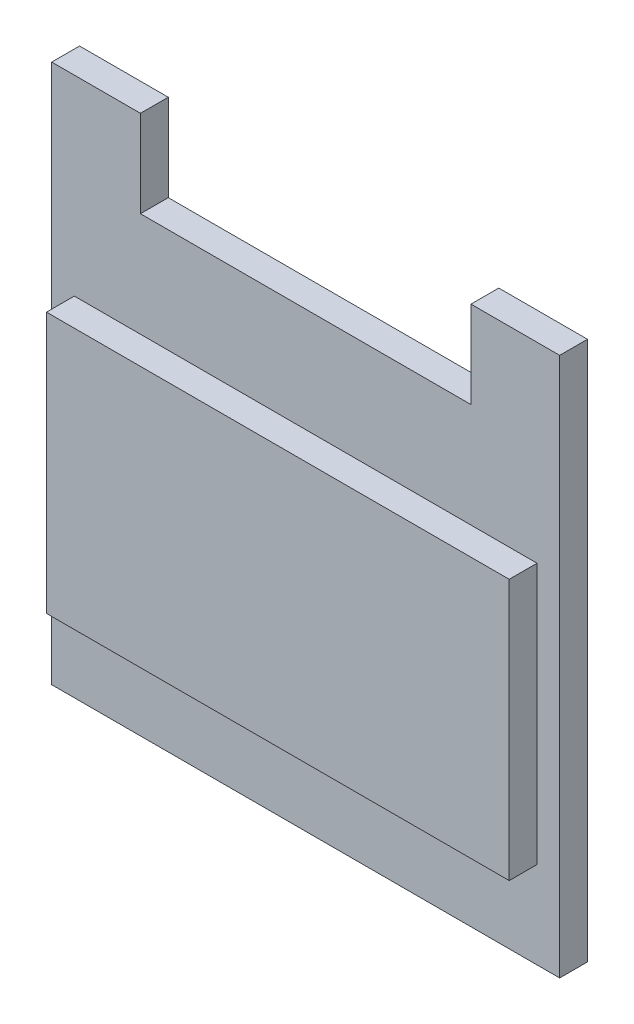
ISO-10303-21;
HEADER;
FILE_DESCRIPTION(('STEP AP214'),'2;1');
FILE_NAME('part.step','',(''),(''),'','','');
FILE_SCHEMA(('AUTOMOTIVE_DESIGN { 1 0 10303 214 1 1 1 1 }'));
ENDSEC;
DATA;
#1=APPLICATION_CONTEXT('core data for automotive mechanical design processes');
#2=APPLICATION_PROTOCOL_DEFINITION('international standard','automotive_design',2000,#1);
#3=PRODUCT_CONTEXT('',#1,'mechanical');
#4=PRODUCT('Part','Part','',(#3));
#5=PRODUCT_RELATED_PRODUCT_CATEGORY('part','',(#4));
#6=PRODUCT_DEFINITION_FORMATION('','',#4);
#7=PRODUCT_DEFINITION_CONTEXT('part definition',#1,'design');
#8=PRODUCT_DEFINITION('design','',#6,#7);
#9=PRODUCT_DEFINITION_SHAPE('','',#8);
#10=(LENGTH_UNIT() NAMED_UNIT(*) SI_UNIT(.MILLI.,.METRE.));
#11=(NAMED_UNIT(*) PLANE_ANGLE_UNIT() SI_UNIT($,.RADIAN.));
#12=(NAMED_UNIT(*) SI_UNIT($,.STERADIAN.) SOLID_ANGLE_UNIT());
#13=UNCERTAINTY_MEASURE_WITH_UNIT(LENGTH_MEASURE(1.E-05),#10,'distance_accuracy_value','');
#14=(GEOMETRIC_REPRESENTATION_CONTEXT(3) GLOBAL_UNCERTAINTY_ASSIGNED_CONTEXT((#13)) GLOBAL_UNIT_ASSIGNED_CONTEXT((#10,
#11,#12)) REPRESENTATION_CONTEXT('',''));
#15=CARTESIAN_POINT('',(0.,0.,0.));
#16=DIRECTION('',(0.,0.,1.));
#17=DIRECTION('',(1.,0.,0.));
#18=AXIS2_PLACEMENT_3D('',#15,#16,#17);
#19=CARTESIAN_POINT('',(0.,15.8034034294257,-1.6));
#20=DIRECTION('',(0.,-1.,0.));
#21=DIRECTION('',(1.,0.,0.));
#22=AXIS2_PLACEMENT_3D('',#19,#20,#21);
#23=PLANE('',#22);
#24=DIRECTION('',(1.,0.,0.));
#25=VECTOR('',#24,1.);
#26=CARTESIAN_POINT('',(0.,15.8034034294257,0.));
#27=LINE('',#26,#25);
#28=CARTESIAN_POINT('',(10.1743747616372,15.8034034294257,0.));
#29=VERTEX_POINT('',#28);
#30=CARTESIAN_POINT('',(15.2743747616372,15.8034034294257,0.));
#31=VERTEX_POINT('',#30);
#32=EDGE_CURVE('E199',#29,#31,#27,.T.);
#33=ORIENTED_EDGE('',*,*,#32,.T.);
#34=DIRECTION('',(0.,0.,1.));
#35=VECTOR('',#34,1.);
#36=CARTESIAN_POINT('',(15.2743747616372,15.8034034294257,-1.6));
#37=LINE('',#36,#35);
#38=CARTESIAN_POINT('',(15.2743747616372,15.8034034294257,-1.6));
#39=VERTEX_POINT('',#38);
#40=EDGE_CURVE('E12',#39,#31,#37,.T.);
#41=ORIENTED_EDGE('',*,*,#40,.F.);
#42=DIRECTION('',(1.,0.,0.));
#43=VECTOR('',#42,1.);
#44=CARTESIAN_POINT('',(0.,15.8034034294257,-1.6));
#45=LINE('',#44,#43);
#46=CARTESIAN_POINT('',(10.1743747616372,15.8034034294257,-1.6));
#47=VERTEX_POINT('',#46);
#48=EDGE_CURVE('E182',#47,#39,#45,.T.);
#49=ORIENTED_EDGE('',*,*,#48,.F.);
#50=DIRECTION('',(0.,0.,1.));
#51=VECTOR('',#50,1.);
#52=CARTESIAN_POINT('',(10.1743747616372,15.8034034294257,-1.6));
#53=LINE('',#52,#51);
#54=EDGE_CURVE('E226',#47,#29,#53,.T.);
#55=ORIENTED_EDGE('',*,*,#54,.T.);
#56=EDGE_LOOP('',(#33,#41,#49,#55));
#57=FACE_BOUND('',#56,.T.);
#58=ADVANCED_FACE('F52',(#57),#23,.F.);
#59=CARTESIAN_POINT('',(15.2743747616372,0.,-1.6));
#60=DIRECTION('',(-1.,0.,0.));
#61=DIRECTION('',(0.,-1.,0.));
#62=AXIS2_PLACEMENT_3D('',#59,#60,#61);
#63=PLANE('',#62);
#64=DIRECTION('',(0.,-1.,0.));
#65=VECTOR('',#64,1.);
#66=CARTESIAN_POINT('',(15.2743747616372,0.,0.));
#67=LINE('',#66,#65);
#68=CARTESIAN_POINT('',(15.2743747616372,-15.1965965705743,0.));
#69=VERTEX_POINT('',#68);
#70=EDGE_CURVE('E123',#31,#69,#67,.T.);
#71=ORIENTED_EDGE('',*,*,#70,.T.);
#72=DIRECTION('',(0.,0.,1.));
#73=VECTOR('',#72,1.);
#74=CARTESIAN_POINT('',(15.2743747616372,-15.1965965705743,-1.6));
#75=LINE('',#74,#73);
#76=CARTESIAN_POINT('',(15.2743747616372,-15.1965965705743,-1.6));
#77=VERTEX_POINT('',#76);
#78=EDGE_CURVE('E61',#77,#69,#75,.T.);
#79=ORIENTED_EDGE('',*,*,#78,.F.);
#80=DIRECTION('',(0.,-1.,0.));
#81=VECTOR('',#80,1.);
#82=CARTESIAN_POINT('',(15.2743747616372,0.,-1.6));
#83=LINE('',#82,#81);
#84=EDGE_CURVE('E77',#39,#77,#83,.T.);
#85=ORIENTED_EDGE('',*,*,#84,.F.);
#86=ORIENTED_EDGE('',*,*,#40,.T.);
#87=EDGE_LOOP('',(#71,#79,#85,#86));
#88=FACE_BOUND('',#87,.T.);
#89=ADVANCED_FACE('F280',(#88),#63,.F.);
#90=CARTESIAN_POINT('',(0.,-15.1965965705743,-1.6));
#91=DIRECTION('',(0.,-1.,0.));
#92=DIRECTION('',(0.,0.,-1.));
#93=AXIS2_PLACEMENT_3D('',#90,#91,#92);
#94=PLANE('',#93);
#95=DIRECTION('',(1.,0.,0.));
#96=VECTOR('',#95,1.);
#97=CARTESIAN_POINT('',(0.,-15.1965965705743,0.));
#98=LINE('',#97,#96);
#99=CARTESIAN_POINT('',(-13.9256252383628,-15.1965965705743,0.));
#100=VERTEX_POINT('',#99);
#101=EDGE_CURVE('E164',#100,#69,#98,.T.);
#102=ORIENTED_EDGE('',*,*,#101,.F.);
#103=DIRECTION('',(0.,0.,1.));
#104=VECTOR('',#103,1.);
#105=CARTESIAN_POINT('',(-13.9256252383628,-15.1965965705743,-1.6));
#106=LINE('',#105,#104);
#107=CARTESIAN_POINT('',(-13.9256252383628,-15.1965965705743,-1.6));
#108=VERTEX_POINT('',#107);
#109=EDGE_CURVE('E160',#108,#100,#106,.T.);
#110=ORIENTED_EDGE('',*,*,#109,.F.);
#111=DIRECTION('',(1.,0.,0.));
#112=VECTOR('',#111,1.);
#113=CARTESIAN_POINT('',(0.,-15.1965965705743,-1.6));
#114=LINE('',#113,#112);
#115=EDGE_CURVE('E163',#108,#77,#114,.T.);
#116=ORIENTED_EDGE('',*,*,#115,.T.);
#117=ORIENTED_EDGE('',*,*,#78,.T.);
#118=EDGE_LOOP('',(#102,#110,#116,#117));
#119=FACE_BOUND('',#118,.T.);
#120=ADVANCED_FACE('F162',(#119),#94,.T.);
#121=CARTESIAN_POINT('',(-13.9256252383628,0.,-1.6));
#122=DIRECTION('',(-1.,0.,0.));
#123=DIRECTION('',(0.,-1.,0.));
#124=AXIS2_PLACEMENT_3D('',#121,#122,#123);
#125=PLANE('',#124);
#126=DIRECTION('',(0.,-1.,0.));
#127=VECTOR('',#126,1.);
#128=CARTESIAN_POINT('',(-13.9256252383628,0.,0.));
#129=LINE('',#128,#127);
#130=CARTESIAN_POINT('',(-13.9256252383628,15.8034034294257,0.));
#131=VERTEX_POINT('',#130);
#132=EDGE_CURVE('E211',#131,#100,#129,.T.);
#133=ORIENTED_EDGE('',*,*,#132,.F.);
#134=DIRECTION('',(0.,0.,1.));
#135=VECTOR('',#134,1.);
#136=CARTESIAN_POINT('',(-13.9256252383628,15.8034034294257,-1.6));
#137=LINE('',#136,#135);
#138=CARTESIAN_POINT('',(-13.9256252383628,15.8034034294257,-1.6));
#139=VERTEX_POINT('',#138);
#140=EDGE_CURVE('E169',#139,#131,#137,.T.);
#141=ORIENTED_EDGE('',*,*,#140,.F.);
#142=DIRECTION('',(0.,-1.,0.));
#143=VECTOR('',#142,1.);
#144=CARTESIAN_POINT('',(-13.9256252383628,0.,-1.6));
#145=LINE('',#144,#143);
#146=EDGE_CURVE('E174',#139,#108,#145,.T.);
#147=ORIENTED_EDGE('',*,*,#146,.T.);
#148=ORIENTED_EDGE('',*,*,#109,.T.);
#149=EDGE_LOOP('',(#133,#141,#147,#148));
#150=FACE_BOUND('',#149,.T.);
#151=ADVANCED_FACE('F176',(#150),#125,.T.);
#152=CARTESIAN_POINT('',(-8.82562523836279,15.8034034294257,0.));
#153=VERTEX_POINT('',#152);
#154=EDGE_CURVE('E203',#131,#153,#27,.T.);
#155=ORIENTED_EDGE('',*,*,#154,.T.);
#156=DIRECTION('',(0.,0.,1.));
#157=VECTOR('',#156,1.);
#158=CARTESIAN_POINT('',(-8.82562523836279,15.8034034294257,-1.6));
#159=LINE('',#158,#157);
#160=CARTESIAN_POINT('',(-8.82562523836279,15.8034034294257,-1.6));
#161=VERTEX_POINT('',#160);
#162=EDGE_CURVE('E218',#161,#153,#159,.T.);
#163=ORIENTED_EDGE('',*,*,#162,.F.);
#164=EDGE_CURVE('E178',#139,#161,#45,.T.);
#165=ORIENTED_EDGE('',*,*,#164,.F.);
#166=ORIENTED_EDGE('',*,*,#140,.T.);
#167=EDGE_LOOP('',(#155,#163,#165,#166));
#168=FACE_BOUND('',#167,.T.);
#169=ADVANCED_FACE('F283',(#168),#23,.F.);
#170=CARTESIAN_POINT('',(-8.82562523836279,0.,-1.6));
#171=DIRECTION('',(-1.,0.,0.));
#172=DIRECTION('',(0.,-1.,0.));
#173=AXIS2_PLACEMENT_3D('',#170,#171,#172);
#174=PLANE('',#173);
#175=DIRECTION('',(0.,-1.,0.));
#176=VECTOR('',#175,1.);
#177=CARTESIAN_POINT('',(-8.82562523836279,0.,0.));
#178=LINE('',#177,#176);
#179=CARTESIAN_POINT('',(-8.82562523836279,10.8034034294257,0.));
#180=VERTEX_POINT('',#179);
#181=EDGE_CURVE('E209',#153,#180,#178,.T.);
#182=ORIENTED_EDGE('',*,*,#181,.T.);
#183=DIRECTION('',(0.,0.,1.));
#184=VECTOR('',#183,1.);
#185=CARTESIAN_POINT('',(-8.82562523836279,10.8034034294257,-1.6));
#186=LINE('',#185,#184);
#187=CARTESIAN_POINT('',(-8.82562523836279,10.8034034294257,-1.6));
#188=VERTEX_POINT('',#187);
#189=EDGE_CURVE('E221',#188,#180,#186,.T.);
#190=ORIENTED_EDGE('',*,*,#189,.F.);
#191=DIRECTION('',(0.,-1.,0.));
#192=VECTOR('',#191,1.);
#193=CARTESIAN_POINT('',(-8.82562523836279,0.,-1.6));
#194=LINE('',#193,#192);
#195=EDGE_CURVE('E180',#161,#188,#194,.T.);
#196=ORIENTED_EDGE('',*,*,#195,.F.);
#197=ORIENTED_EDGE('',*,*,#162,.T.);
#198=EDGE_LOOP('',(#182,#190,#196,#197));
#199=FACE_BOUND('',#198,.T.);
#200=ADVANCED_FACE('F269',(#199),#174,.F.);
#201=CARTESIAN_POINT('',(0.,10.8034034294257,-1.6));
#202=DIRECTION('',(0.,-1.,0.));
#203=DIRECTION('',(1.,0.,0.));
#204=AXIS2_PLACEMENT_3D('',#201,#202,#203);
#205=PLANE('',#204);
#206=DIRECTION('',(1.,0.,0.));
#207=VECTOR('',#206,1.);
#208=CARTESIAN_POINT('',(0.,10.8034034294257,0.));
#209=LINE('',#208,#207);
#210=CARTESIAN_POINT('',(10.1743747616372,10.8034034294257,0.));
#211=VERTEX_POINT('',#210);
#212=EDGE_CURVE('E206',#180,#211,#209,.T.);
#213=ORIENTED_EDGE('',*,*,#212,.T.);
#214=DIRECTION('',(0.,0.,1.));
#215=VECTOR('',#214,1.);
#216=CARTESIAN_POINT('',(10.1743747616372,10.8034034294257,-1.6));
#217=LINE('',#216,#215);
#218=CARTESIAN_POINT('',(10.1743747616372,10.8034034294257,-1.6));
#219=VERTEX_POINT('',#218);
#220=EDGE_CURVE('E224',#219,#211,#217,.T.);
#221=ORIENTED_EDGE('',*,*,#220,.F.);
#222=DIRECTION('',(1.,0.,0.));
#223=VECTOR('',#222,1.);
#224=CARTESIAN_POINT('',(0.,10.8034034294257,-1.6));
#225=LINE('',#224,#223);
#226=EDGE_CURVE('E261',#188,#219,#225,.T.);
#227=ORIENTED_EDGE('',*,*,#226,.F.);
#228=ORIENTED_EDGE('',*,*,#189,.T.);
#229=EDGE_LOOP('',(#213,#221,#227,#228));
#230=FACE_BOUND('',#229,.T.);
#231=ADVANCED_FACE('F273',(#230),#205,.F.);
#232=CARTESIAN_POINT('',(0.,4.80340342942573,-1.6));
#233=DIRECTION('',(0.,-1.,0.));
#234=DIRECTION('',(0.,0.,-1.));
#235=AXIS2_PLACEMENT_3D('',#232,#233,#234);
#236=PLANE('',#235);
#237=DIRECTION('',(1.,0.,0.));
#238=VECTOR('',#237,1.);
#239=CARTESIAN_POINT('',(0.,4.80340342942573,0.));
#240=LINE('',#239,#238);
#241=CARTESIAN_POINT('',(-12.6256252383628,4.80340342942573,0.));
#242=VERTEX_POINT('',#241);
#243=CARTESIAN_POINT('',(13.9743747616372,4.80340342942573,0.));
#244=VERTEX_POINT('',#243);
#245=EDGE_CURVE('E187',#242,#244,#240,.T.);
#246=ORIENTED_EDGE('',*,*,#245,.F.);
#247=DIRECTION('',(0.,0.,1.));
#248=VECTOR('',#247,1.);
#249=CARTESIAN_POINT('',(-12.6256252383628,4.80340342942573,-1.6));
#250=LINE('',#249,#248);
#251=CARTESIAN_POINT('',(-12.6256252383628,4.80340342942573,-1.6));
#252=VERTEX_POINT('',#251);
#253=EDGE_CURVE('E228',#252,#242,#250,.T.);
#254=ORIENTED_EDGE('',*,*,#253,.F.);
#255=DIRECTION('',(1.,0.,0.));
#256=VECTOR('',#255,1.);
#257=CARTESIAN_POINT('',(0.,4.80340342942573,-1.6));
#258=LINE('',#257,#256);
#259=CARTESIAN_POINT('',(13.9743747616372,4.80340342942573,-1.6));
#260=VERTEX_POINT('',#259);
#261=EDGE_CURVE('E214',#252,#260,#258,.T.);
#262=ORIENTED_EDGE('',*,*,#261,.T.);
#263=DIRECTION('',(0.,0.,1.));
#264=VECTOR('',#263,1.);
#265=CARTESIAN_POINT('',(13.9743747616372,4.80340342942573,-1.6));
#266=LINE('',#265,#264);
#267=EDGE_CURVE('E56',#260,#244,#266,.T.);
#268=ORIENTED_EDGE('',*,*,#267,.T.);
#269=EDGE_LOOP('',(#246,#254,#262,#268));
#270=FACE_BOUND('',#269,.T.);
#271=ADVANCED_FACE('F54',(#270),#236,.T.);
#272=CARTESIAN_POINT('',(-12.6256252383628,0.,-1.6));
#273=DIRECTION('',(-1.,0.,0.));
#274=DIRECTION('',(0.,-1.,0.));
#275=AXIS2_PLACEMENT_3D('',#272,#273,#274);
#276=PLANE('',#275);
#277=DIRECTION('',(0.,-1.,0.));
#278=VECTOR('',#277,1.);
#279=CARTESIAN_POINT('',(-12.6256252383628,0.,0.));
#280=LINE('',#279,#278);
#281=CARTESIAN_POINT('',(-12.6256252383628,-10.1965965705743,0.));
#282=VERTEX_POINT('',#281);
#283=EDGE_CURVE('E197',#242,#282,#280,.T.);
#284=ORIENTED_EDGE('',*,*,#283,.T.);
#285=DIRECTION('',(0.,0.,1.));
#286=VECTOR('',#285,1.);
#287=CARTESIAN_POINT('',(-12.6256252383628,-10.1965965705743,-1.6));
#288=LINE('',#287,#286);
#289=CARTESIAN_POINT('',(-12.6256252383628,-10.1965965705743,-1.6));
#290=VERTEX_POINT('',#289);
#291=EDGE_CURVE('E230',#290,#282,#288,.T.);
#292=ORIENTED_EDGE('',*,*,#291,.F.);
#293=DIRECTION('',(0.,-1.,0.));
#294=VECTOR('',#293,1.);
#295=CARTESIAN_POINT('',(-12.6256252383628,0.,-1.6));
#296=LINE('',#295,#294);
#297=EDGE_CURVE('E252',#252,#290,#296,.T.);
#298=ORIENTED_EDGE('',*,*,#297,.F.);
#299=ORIENTED_EDGE('',*,*,#253,.T.);
#300=EDGE_LOOP('',(#284,#292,#298,#299));
#301=FACE_BOUND('',#300,.T.);
#302=ADVANCED_FACE('F245',(#301),#276,.F.);
#303=CARTESIAN_POINT('',(0.,-10.1965965705743,-1.6));
#304=DIRECTION('',(0.,-1.,0.));
#305=DIRECTION('',(0.,0.,-1.));
#306=AXIS2_PLACEMENT_3D('',#303,#304,#305);
#307=PLANE('',#306);
#308=DIRECTION('',(1.,0.,0.));
#309=VECTOR('',#308,1.);
#310=CARTESIAN_POINT('',(0.,-10.1965965705743,0.));
#311=LINE('',#310,#309);
#312=CARTESIAN_POINT('',(13.9743747616372,-10.1965965705743,0.));
#313=VERTEX_POINT('',#312);
#314=EDGE_CURVE('E194',#282,#313,#311,.T.);
#315=ORIENTED_EDGE('',*,*,#314,.T.);
#316=DIRECTION('',(0.,0.,1.));
#317=VECTOR('',#316,1.);
#318=CARTESIAN_POINT('',(13.9743747616372,-10.1965965705743,-1.6));
#319=LINE('',#318,#317);
#320=CARTESIAN_POINT('',(13.9743747616372,-10.1965965705743,-1.6));
#321=VERTEX_POINT('',#320);
#322=EDGE_CURVE('E232',#321,#313,#319,.T.);
#323=ORIENTED_EDGE('',*,*,#322,.F.);
#324=DIRECTION('',(1.,0.,0.));
#325=VECTOR('',#324,1.);
#326=CARTESIAN_POINT('',(0.,-10.1965965705743,-1.6));
#327=LINE('',#326,#325);
#328=EDGE_CURVE('E250',#290,#321,#327,.T.);
#329=ORIENTED_EDGE('',*,*,#328,.F.);
#330=ORIENTED_EDGE('',*,*,#291,.T.);
#331=EDGE_LOOP('',(#315,#323,#329,#330));
#332=FACE_BOUND('',#331,.T.);
#333=ADVANCED_FACE('F249',(#332),#307,.F.);
#334=CARTESIAN_POINT('',(13.9743747616372,0.,-1.6));
#335=DIRECTION('',(-1.,0.,0.));
#336=DIRECTION('',(0.,-1.,0.));
#337=AXIS2_PLACEMENT_3D('',#334,#335,#336);
#338=PLANE('',#337);
#339=DIRECTION('',(0.,-1.,0.));
#340=VECTOR('',#339,1.);
#341=CARTESIAN_POINT('',(13.9743747616372,0.,0.));
#342=LINE('',#341,#340);
#343=EDGE_CURVE('E190',#244,#313,#342,.T.);
#344=ORIENTED_EDGE('',*,*,#343,.F.);
#345=ORIENTED_EDGE('',*,*,#267,.F.);
#346=DIRECTION('',(0.,-1.,0.));
#347=VECTOR('',#346,1.);
#348=CARTESIAN_POINT('',(13.9743747616372,0.,-1.6));
#349=LINE('',#348,#347);
#350=EDGE_CURVE('E253',#260,#321,#349,.T.);
#351=ORIENTED_EDGE('',*,*,#350,.T.);
#352=ORIENTED_EDGE('',*,*,#322,.T.);
#353=EDGE_LOOP('',(#344,#345,#351,#352));
#354=FACE_BOUND('',#353,.T.);
#355=ADVANCED_FACE('F238',(#354),#338,.T.);
#356=CARTESIAN_POINT('',(10.1743747616372,0.,-1.6));
#357=DIRECTION('',(-1.,0.,0.));
#358=DIRECTION('',(0.,-1.,0.));
#359=AXIS2_PLACEMENT_3D('',#356,#357,#358);
#360=PLANE('',#359);
#361=DIRECTION('',(0.,-1.,0.));
#362=VECTOR('',#361,1.);
#363=CARTESIAN_POINT('',(10.1743747616372,0.,0.));
#364=LINE('',#363,#362);
#365=EDGE_CURVE('E202',#29,#211,#364,.T.);
#366=ORIENTED_EDGE('',*,*,#365,.F.);
#367=ORIENTED_EDGE('',*,*,#54,.F.);
#368=DIRECTION('',(0.,-1.,0.));
#369=VECTOR('',#368,1.);
#370=CARTESIAN_POINT('',(10.1743747616372,0.,-1.6));
#371=LINE('',#370,#369);
#372=EDGE_CURVE('E259',#47,#219,#371,.T.);
#373=ORIENTED_EDGE('',*,*,#372,.T.);
#374=ORIENTED_EDGE('',*,*,#220,.T.);
#375=EDGE_LOOP('',(#366,#367,#373,#374));
#376=FACE_BOUND('',#375,.T.);
#377=ADVANCED_FACE('F276',(#376),#360,.T.);
#378=CARTESIAN_POINT('',(0.,0.,-1.6));
#379=DIRECTION('',(0.,0.,1.));
#380=DIRECTION('',(1.,0.,0.));
#381=AXIS2_PLACEMENT_3D('',#378,#379,#380);
#382=PLANE('',#381);
#383=DIRECTION('',(0.,1.,0.));
#384=VECTOR('',#383,1.);
#385=CARTESIAN_POINT('',(10.6743747616372,0.,-1.6));
#386=LINE('',#385,#384);
#387=CARTESIAN_POINT('',(10.6743747616372,-14.0144990149043,-1.6));
#388=VERTEX_POINT('',#387);
#389=CARTESIAN_POINT('',(10.6743747616372,-12.0144990149043,-1.6));
#390=VERTEX_POINT('',#389);
#391=EDGE_CURVE('E368',#388,#390,#386,.T.);
#392=ORIENTED_EDGE('',*,*,#391,.T.);
#393=DIRECTION('',(-1.,0.,0.));
#394=VECTOR('',#393,1.);
#395=CARTESIAN_POINT('',(0.,-12.0144990149043,-1.6));
#396=LINE('',#395,#394);
#397=CARTESIAN_POINT('',(-9.32562523836279,-12.0144990149043,-1.6));
#398=VERTEX_POINT('',#397);
#399=EDGE_CURVE('E191',#390,#398,#396,.T.);
#400=ORIENTED_EDGE('',*,*,#399,.T.);
#401=DIRECTION('',(0.,-1.,0.));
#402=VECTOR('',#401,1.);
#403=CARTESIAN_POINT('',(-9.32562523836279,0.,-1.6));
#404=LINE('',#403,#402);
#405=CARTESIAN_POINT('',(-9.32562523836279,-14.0144990149043,-1.6));
#406=VERTEX_POINT('',#405);
#407=EDGE_CURVE('E360',#398,#406,#404,.T.);
#408=ORIENTED_EDGE('',*,*,#407,.T.);
#409=DIRECTION('',(1.,0.,0.));
#410=VECTOR('',#409,1.);
#411=CARTESIAN_POINT('',(0.,-14.0144990149043,-1.6));
#412=LINE('',#411,#410);
#413=EDGE_CURVE('E365',#406,#388,#412,.T.);
#414=ORIENTED_EDGE('',*,*,#413,.T.);
#415=EDGE_LOOP('',(#392,#400,#408,#414));
#416=FACE_BOUND('',#415,.T.);
#417=ORIENTED_EDGE('',*,*,#261,.F.);
#418=ORIENTED_EDGE('',*,*,#297,.T.);
#419=ORIENTED_EDGE('',*,*,#328,.T.);
#420=ORIENTED_EDGE('',*,*,#350,.F.);
#421=EDGE_LOOP('',(#417,#418,#419,#420));
#422=FACE_BOUND('',#421,.T.);
#423=ORIENTED_EDGE('',*,*,#48,.T.);
#424=ORIENTED_EDGE('',*,*,#84,.T.);
#425=ORIENTED_EDGE('',*,*,#115,.F.);
#426=ORIENTED_EDGE('',*,*,#146,.F.);
#427=ORIENTED_EDGE('',*,*,#164,.T.);
#428=ORIENTED_EDGE('',*,*,#195,.T.);
#429=ORIENTED_EDGE('',*,*,#226,.T.);
#430=ORIENTED_EDGE('',*,*,#372,.F.);
#431=EDGE_LOOP('',(#423,#424,#425,#426,#427,#428,#429,#430));
#432=FACE_BOUND('',#431,.T.);
#433=ADVANCED_FACE('F173',(#416,#422,#432),#382,.F.);
#434=CARTESIAN_POINT('',(0.,0.,0.));
#435=DIRECTION('',(0.,0.,1.));
#436=DIRECTION('',(1.,0.,0.));
#437=AXIS2_PLACEMENT_3D('',#434,#435,#436);
#438=PLANE('',#437);
#439=ORIENTED_EDGE('',*,*,#245,.T.);
#440=ORIENTED_EDGE('',*,*,#343,.T.);
#441=ORIENTED_EDGE('',*,*,#314,.F.);
#442=ORIENTED_EDGE('',*,*,#283,.F.);
#443=EDGE_LOOP('',(#439,#440,#441,#442));
#444=FACE_BOUND('',#443,.T.);
#445=ORIENTED_EDGE('',*,*,#32,.F.);
#446=ORIENTED_EDGE('',*,*,#365,.T.);
#447=ORIENTED_EDGE('',*,*,#212,.F.);
#448=ORIENTED_EDGE('',*,*,#181,.F.);
#449=ORIENTED_EDGE('',*,*,#154,.F.);
#450=ORIENTED_EDGE('',*,*,#132,.T.);
#451=ORIENTED_EDGE('',*,*,#101,.T.);
#452=ORIENTED_EDGE('',*,*,#70,.F.);
#453=EDGE_LOOP('',(#445,#446,#447,#448,#449,#450,#451,#452));
#454=FACE_BOUND('',#453,.T.);
#455=ADVANCED_FACE('F242',(#444,#454),#438,.T.);
#456=CARTESIAN_POINT('',(-9.32562523836279,-12.0144990149043,-4.1));
#457=DIRECTION('',(0.,1.,0.));
#458=DIRECTION('',(0.,0.,1.));
#459=AXIS2_PLACEMENT_3D('',#456,#457,#458);
#460=PLANE('',#459);
#461=ORIENTED_EDGE('',*,*,#399,.F.);
#462=DIRECTION('',(0.,0.,1.));
#463=VECTOR('',#462,1.);
#464=CARTESIAN_POINT('',(10.6743747616372,-12.0144990149043,-4.1));
#465=LINE('',#464,#463);
#466=CARTESIAN_POINT('',(10.6743747616372,-12.0144990149043,-4.1));
#467=VERTEX_POINT('',#466);
#468=EDGE_CURVE('E347',#467,#390,#465,.T.);
#469=ORIENTED_EDGE('',*,*,#468,.F.);
#470=DIRECTION('',(-1.,0.,0.));
#471=VECTOR('',#470,1.);
#472=CARTESIAN_POINT('',(-9.32562523836279,-12.0144990149043,-4.1));
#473=LINE('',#472,#471);
#474=CARTESIAN_POINT('',(-9.32562523836279,-12.0144990149043,-4.1));
#475=VERTEX_POINT('',#474);
#476=EDGE_CURVE('E332',#467,#475,#473,.T.);
#477=ORIENTED_EDGE('',*,*,#476,.T.);
#478=DIRECTION('',(0.,0.,1.));
#479=VECTOR('',#478,1.);
#480=CARTESIAN_POINT('',(-9.32562523836279,-12.0144990149043,-4.1));
#481=LINE('',#480,#479);
#482=EDGE_CURVE('E352',#475,#398,#481,.T.);
#483=ORIENTED_EDGE('',*,*,#482,.T.);
#484=EDGE_LOOP('',(#461,#469,#477,#483));
#485=FACE_BOUND('',#484,.T.);
#486=ADVANCED_FACE('F304',(#485),#460,.T.);
#487=CARTESIAN_POINT('',(10.6743747616372,-12.0144990149043,-4.1));
#488=DIRECTION('',(1.,0.,0.));
#489=DIRECTION('',(0.,0.,-1.));
#490=AXIS2_PLACEMENT_3D('',#487,#488,#489);
#491=PLANE('',#490);
#492=ORIENTED_EDGE('',*,*,#391,.F.);
#493=DIRECTION('',(0.,0.,1.));
#494=VECTOR('',#493,1.);
#495=CARTESIAN_POINT('',(10.6743747616372,-14.0144990149043,-4.1));
#496=LINE('',#495,#494);
#497=CARTESIAN_POINT('',(10.6743747616372,-14.0144990149043,-4.1));
#498=VERTEX_POINT('',#497);
#499=EDGE_CURVE('E350',#498,#388,#496,.T.);
#500=ORIENTED_EDGE('',*,*,#499,.F.);
#501=DIRECTION('',(0.,1.,0.));
#502=VECTOR('',#501,1.);
#503=CARTESIAN_POINT('',(10.6743747616372,-12.0144990149043,-4.1));
#504=LINE('',#503,#502);
#505=EDGE_CURVE('E336',#498,#467,#504,.T.);
#506=ORIENTED_EDGE('',*,*,#505,.T.);
#507=ORIENTED_EDGE('',*,*,#468,.T.);
#508=EDGE_LOOP('',(#492,#500,#506,#507));
#509=FACE_BOUND('',#508,.T.);
#510=ADVANCED_FACE('F310',(#509),#491,.T.);
#511=CARTESIAN_POINT('',(-9.32562523836279,-14.0144990149043,-4.1));
#512=DIRECTION('',(0.,-1.,0.));
#513=DIRECTION('',(0.,0.,-1.));
#514=AXIS2_PLACEMENT_3D('',#511,#512,#513);
#515=PLANE('',#514);
#516=ORIENTED_EDGE('',*,*,#413,.F.);
#517=DIRECTION('',(0.,0.,1.));
#518=VECTOR('',#517,1.);
#519=CARTESIAN_POINT('',(-9.32562523836279,-14.0144990149043,-4.1));
#520=LINE('',#519,#518);
#521=CARTESIAN_POINT('',(-9.32562523836279,-14.0144990149043,-4.1));
#522=VERTEX_POINT('',#521);
#523=EDGE_CURVE('E69',#522,#406,#520,.T.);
#524=ORIENTED_EDGE('',*,*,#523,.F.);
#525=DIRECTION('',(1.,0.,0.));
#526=VECTOR('',#525,1.);
#527=CARTESIAN_POINT('',(-9.32562523836279,-14.0144990149043,-4.1));
#528=LINE('',#527,#526);
#529=EDGE_CURVE('E353',#522,#498,#528,.T.);
#530=ORIENTED_EDGE('',*,*,#529,.T.);
#531=ORIENTED_EDGE('',*,*,#499,.T.);
#532=EDGE_LOOP('',(#516,#524,#530,#531));
#533=FACE_BOUND('',#532,.T.);
#534=ADVANCED_FACE('F316',(#533),#515,.T.);
#535=CARTESIAN_POINT('',(-9.32562523836279,-12.0144990149043,-4.1));
#536=DIRECTION('',(-1.,0.,0.));
#537=DIRECTION('',(0.,0.,1.));
#538=AXIS2_PLACEMENT_3D('',#535,#536,#537);
#539=PLANE('',#538);
#540=ORIENTED_EDGE('',*,*,#407,.F.);
#541=ORIENTED_EDGE('',*,*,#482,.F.);
#542=DIRECTION('',(0.,-1.,0.));
#543=VECTOR('',#542,1.);
#544=CARTESIAN_POINT('',(-9.32562523836279,-12.0144990149043,-4.1));
#545=LINE('',#544,#543);
#546=EDGE_CURVE('E338',#475,#522,#545,.T.);
#547=ORIENTED_EDGE('',*,*,#546,.T.);
#548=ORIENTED_EDGE('',*,*,#523,.T.);
#549=EDGE_LOOP('',(#540,#541,#547,#548));
#550=FACE_BOUND('',#549,.T.);
#551=ADVANCED_FACE('F312',(#550),#539,.T.);
#552=CARTESIAN_POINT('',(0.,0.,-4.1));
#553=DIRECTION('',(0.,0.,-1.));
#554=DIRECTION('',(-1.,0.,0.));
#555=AXIS2_PLACEMENT_3D('',#552,#553,#554);
#556=PLANE('',#555);
#557=ORIENTED_EDGE('',*,*,#476,.F.);
#558=ORIENTED_EDGE('',*,*,#505,.F.);
#559=ORIENTED_EDGE('',*,*,#529,.F.);
#560=ORIENTED_EDGE('',*,*,#546,.F.);
#561=EDGE_LOOP('',(#557,#558,#559,#560));
#562=FACE_BOUND('',#561,.T.);
#563=ADVANCED_FACE('F315',(#562),#556,.T.);
#564=CLOSED_SHELL('',(#58,#89,#120,#151,#169,#200,#231,#271,#302,#333,#355,#377,#433,#455,#486,
#510,#534,#551,#563));
#565=MANIFOLD_SOLID_BREP('B2',#564);
#566=CARTESIAN_POINT('',(-12.6256252383628,4.80340342942573,1.6));
#567=DIRECTION('',(1.,0.,0.));
#568=DIRECTION('',(0.,1.,0.));
#569=AXIS2_PLACEMENT_3D('',#566,#567,#568);
#570=PLANE('',#569);
#571=DIRECTION('',(0.,-1.,0.));
#572=VECTOR('',#571,1.);
#573=CARTESIAN_POINT('',(-12.6256252383628,4.80340342942573,-1.6));
#574=LINE('',#573,#572);
#575=CARTESIAN_POINT('',(-12.6256252383628,4.80340342942573,-1.6));
#576=VERTEX_POINT('',#575);
#577=CARTESIAN_POINT('',(-12.6256252383628,-10.1965965705743,-1.6));
#578=VERTEX_POINT('',#577);
#579=EDGE_CURVE('E560',#576,#578,#574,.T.);
#580=ORIENTED_EDGE('',*,*,#579,.T.);
#581=DIRECTION('',(0.,0.,-1.));
#582=VECTOR('',#581,1.);
#583=CARTESIAN_POINT('',(-12.6256252383628,-10.1965965705743,1.6));
#584=LINE('',#583,#582);
#585=CARTESIAN_POINT('',(-12.6256252383628,-10.1965965705743,1.6));
#586=VERTEX_POINT('',#585);
#587=EDGE_CURVE('E50',#586,#578,#584,.T.);
#588=ORIENTED_EDGE('',*,*,#587,.F.);
#589=DIRECTION('',(0.,-1.,0.));
#590=VECTOR('',#589,1.);
#591=CARTESIAN_POINT('',(-12.6256252383628,4.80340342942573,1.6));
#592=LINE('',#591,#590);
#593=CARTESIAN_POINT('',(-12.6256252383628,4.80340342942573,1.6));
#594=VERTEX_POINT('',#593);
#595=EDGE_CURVE('E546',#594,#586,#592,.T.);
#596=ORIENTED_EDGE('',*,*,#595,.F.);
#597=DIRECTION('',(0.,0.,-1.));
#598=VECTOR('',#597,1.);
#599=CARTESIAN_POINT('',(-12.6256252383628,4.80340342942573,1.6));
#600=LINE('',#599,#598);
#601=EDGE_CURVE('E513',#594,#576,#600,.T.);
#602=ORIENTED_EDGE('',*,*,#601,.T.);
#603=EDGE_LOOP('',(#580,#588,#596,#602));
#604=FACE_BOUND('',#603,.T.);
#605=ADVANCED_FACE('F497',(#604),#570,.F.);
#606=CARTESIAN_POINT('',(-12.6256252383628,-10.1965965705743,1.6));
#607=DIRECTION('',(0.,1.,0.));
#608=DIRECTION('',(0.,0.,1.));
#609=AXIS2_PLACEMENT_3D('',#606,#607,#608);
#610=PLANE('',#609);
#611=DIRECTION('',(1.,0.,0.));
#612=VECTOR('',#611,1.);
#613=CARTESIAN_POINT('',(-12.6256252383628,-10.1965965705743,-1.6));
#614=LINE('',#613,#612);
#615=CARTESIAN_POINT('',(13.9743747616372,-10.1965965705743,-1.6));
#616=VERTEX_POINT('',#615);
#617=EDGE_CURVE('E551',#578,#616,#614,.T.);
#618=ORIENTED_EDGE('',*,*,#617,.T.);
#619=DIRECTION('',(0.,0.,-1.));
#620=VECTOR('',#619,1.);
#621=CARTESIAN_POINT('',(13.9743747616372,-10.1965965705743,1.6));
#622=LINE('',#621,#620);
#623=CARTESIAN_POINT('',(13.9743747616372,-10.1965965705743,1.6));
#624=VERTEX_POINT('',#623);
#625=EDGE_CURVE('E505',#624,#616,#622,.T.);
#626=ORIENTED_EDGE('',*,*,#625,.F.);
#627=DIRECTION('',(1.,0.,0.));
#628=VECTOR('',#627,1.);
#629=CARTESIAN_POINT('',(-12.6256252383628,-10.1965965705743,1.6));
#630=LINE('',#629,#628);
#631=EDGE_CURVE('E538',#586,#624,#630,.T.);
#632=ORIENTED_EDGE('',*,*,#631,.F.);
#633=ORIENTED_EDGE('',*,*,#587,.T.);
#634=EDGE_LOOP('',(#618,#626,#632,#633));
#635=FACE_BOUND('',#634,.T.);
#636=ADVANCED_FACE('F550',(#635),#610,.F.);
#637=CARTESIAN_POINT('',(13.9743747616372,4.80340342942573,1.6));
#638=DIRECTION('',(1.,0.,0.));
#639=DIRECTION('',(0.,1.,0.));
#640=AXIS2_PLACEMENT_3D('',#637,#638,#639);
#641=PLANE('',#640);
#642=DIRECTION('',(0.,-1.,0.));
#643=VECTOR('',#642,1.);
#644=CARTESIAN_POINT('',(13.9743747616372,4.80340342942573,-1.6));
#645=LINE('',#644,#643);
#646=CARTESIAN_POINT('',(13.9743747616372,4.80340342942573,-1.6));
#647=VERTEX_POINT('',#646);
#648=EDGE_CURVE('E563',#647,#616,#645,.T.);
#649=ORIENTED_EDGE('',*,*,#648,.F.);
#650=DIRECTION('',(0.,0.,-1.));
#651=VECTOR('',#650,1.);
#652=CARTESIAN_POINT('',(13.9743747616372,4.80340342942573,1.6));
#653=LINE('',#652,#651);
#654=CARTESIAN_POINT('',(13.9743747616372,4.80340342942573,1.6));
#655=VERTEX_POINT('',#654);
#656=EDGE_CURVE('E527',#655,#647,#653,.T.);
#657=ORIENTED_EDGE('',*,*,#656,.F.);
#658=DIRECTION('',(0.,-1.,0.));
#659=VECTOR('',#658,1.);
#660=CARTESIAN_POINT('',(13.9743747616372,4.80340342942573,1.6));
#661=LINE('',#660,#659);
#662=EDGE_CURVE('E545',#655,#624,#661,.T.);
#663=ORIENTED_EDGE('',*,*,#662,.T.);
#664=ORIENTED_EDGE('',*,*,#625,.T.);
#665=EDGE_LOOP('',(#649,#657,#663,#664));
#666=FACE_BOUND('',#665,.T.);
#667=ADVANCED_FACE('F554',(#666),#641,.T.);
#668=CARTESIAN_POINT('',(-12.6256252383628,4.80340342942573,1.6));
#669=DIRECTION('',(0.,1.,0.));
#670=DIRECTION('',(0.,0.,1.));
#671=AXIS2_PLACEMENT_3D('',#668,#669,#670);
#672=PLANE('',#671);
#673=DIRECTION('',(1.,0.,0.));
#674=VECTOR('',#673,1.);
#675=CARTESIAN_POINT('',(-12.6256252383628,4.80340342942573,-1.6));
#676=LINE('',#675,#674);
#677=EDGE_CURVE('E565',#576,#647,#676,.T.);
#678=ORIENTED_EDGE('',*,*,#677,.F.);
#679=ORIENTED_EDGE('',*,*,#601,.F.);
#680=DIRECTION('',(1.,0.,0.));
#681=VECTOR('',#680,1.);
#682=CARTESIAN_POINT('',(-12.6256252383628,4.80340342942573,1.6));
#683=LINE('',#682,#681);
#684=EDGE_CURVE('E555',#594,#655,#683,.T.);
#685=ORIENTED_EDGE('',*,*,#684,.T.);
#686=ORIENTED_EDGE('',*,*,#656,.T.);
#687=EDGE_LOOP('',(#678,#679,#685,#686));
#688=FACE_BOUND('',#687,.T.);
#689=ADVANCED_FACE('F571',(#688),#672,.T.);
#690=CARTESIAN_POINT('',(0.,0.,1.6));
#691=DIRECTION('',(0.,0.,1.));
#692=DIRECTION('',(1.,0.,0.));
#693=AXIS2_PLACEMENT_3D('',#690,#691,#692);
#694=PLANE('',#693);
#695=ORIENTED_EDGE('',*,*,#595,.T.);
#696=ORIENTED_EDGE('',*,*,#631,.T.);
#697=ORIENTED_EDGE('',*,*,#662,.F.);
#698=ORIENTED_EDGE('',*,*,#684,.F.);
#699=EDGE_LOOP('',(#695,#696,#697,#698));
#700=FACE_BOUND('',#699,.T.);
#701=ADVANCED_FACE('F542',(#700),#694,.T.);
#702=CARTESIAN_POINT('',(0.,0.,-1.6));
#703=DIRECTION('',(0.,0.,1.));
#704=DIRECTION('',(1.,0.,0.));
#705=AXIS2_PLACEMENT_3D('',#702,#703,#704);
#706=PLANE('',#705);
#707=ORIENTED_EDGE('',*,*,#579,.F.);
#708=ORIENTED_EDGE('',*,*,#677,.T.);
#709=ORIENTED_EDGE('',*,*,#648,.T.);
#710=ORIENTED_EDGE('',*,*,#617,.F.);
#711=EDGE_LOOP('',(#707,#708,#709,#710));
#712=FACE_BOUND('',#711,.T.);
#713=ADVANCED_FACE('F570',(#712),#706,.F.);
#714=CLOSED_SHELL('',(#605,#636,#667,#689,#701,#713));
#715=MANIFOLD_SOLID_BREP('B6',#714);
#716=ADVANCED_BREP_SHAPE_REPRESENTATION('',(#18,#565,#715),#14);
#717=SHAPE_DEFINITION_REPRESENTATION(#9,#716);
ENDSEC;
END-ISO-10303-21;
